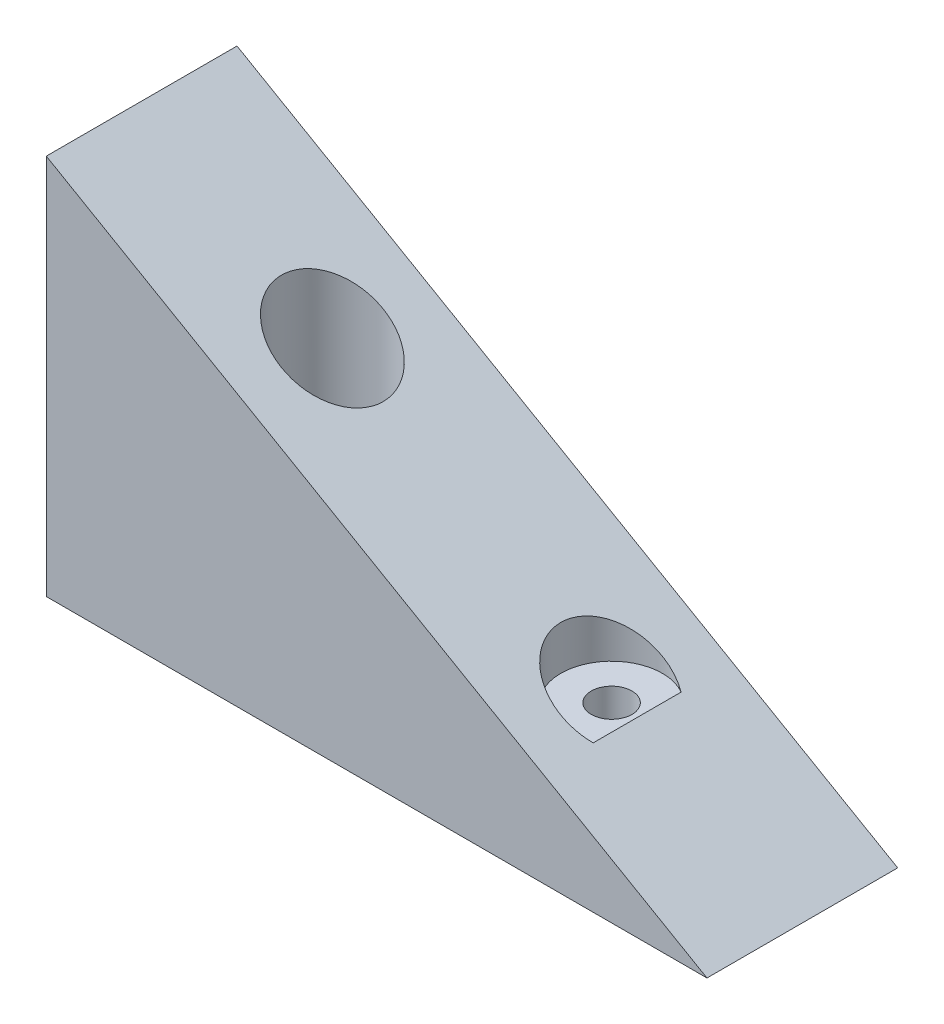
ISO-10303-21;
HEADER;
FILE_DESCRIPTION(('STEP AP214'),'2;1');
FILE_NAME('part.step','',(''),(''),'','','');
FILE_SCHEMA(('AUTOMOTIVE_DESIGN { 1 0 10303 214 1 1 1 1 }'));
ENDSEC;
DATA;
#1=APPLICATION_CONTEXT('core data for automotive mechanical design processes');
#2=APPLICATION_PROTOCOL_DEFINITION('international standard','automotive_design',2000,#1);
#3=PRODUCT_CONTEXT('',#1,'mechanical');
#4=PRODUCT('Part','Part','',(#3));
#5=PRODUCT_RELATED_PRODUCT_CATEGORY('part','',(#4));
#6=PRODUCT_DEFINITION_FORMATION('','',#4);
#7=PRODUCT_DEFINITION_CONTEXT('part definition',#1,'design');
#8=PRODUCT_DEFINITION('design','',#6,#7);
#9=PRODUCT_DEFINITION_SHAPE('','',#8);
#10=(LENGTH_UNIT() NAMED_UNIT(*) SI_UNIT(.MILLI.,.METRE.));
#11=(NAMED_UNIT(*) PLANE_ANGLE_UNIT() SI_UNIT($,.RADIAN.));
#12=(NAMED_UNIT(*) SI_UNIT($,.STERADIAN.) SOLID_ANGLE_UNIT());
#13=UNCERTAINTY_MEASURE_WITH_UNIT(LENGTH_MEASURE(1.E-05),#10,'distance_accuracy_value','');
#14=(GEOMETRIC_REPRESENTATION_CONTEXT(3) GLOBAL_UNCERTAINTY_ASSIGNED_CONTEXT((#13)) GLOBAL_UNIT_ASSIGNED_CONTEXT((#10,
#11,#12)) REPRESENTATION_CONTEXT('',''));
#15=CARTESIAN_POINT('',(0.,0.,0.));
#16=DIRECTION('',(0.,0.,1.));
#17=DIRECTION('',(1.,0.,0.));
#18=AXIS2_PLACEMENT_3D('',#15,#16,#17);
#19=CARTESIAN_POINT('',(0.,0.,15.));
#20=DIRECTION('',(0.500000000000001,0.866025403784438,0.));
#21=DIRECTION('',(-0.866025403784438,0.500000000000001,0.));
#22=AXIS2_PLACEMENT_3D('',#19,#20,#21);
#23=PLANE('',#22);
#24=CARTESIAN_POINT('',(-10.9807621135331,6.33974596215562,7.5));
#25=DIRECTION('',(0.500000000000001,0.866025403784438,0.));
#26=DIRECTION('',(0.866025403784438,-0.500000000000001,0.));
#27=AXIS2_PLACEMENT_3D('',#24,#25,#26);
#28=ELLIPSE('',#27,4.61880215351701,4.);
#29=CARTESIAN_POINT('',(-6.98076211353313,4.03034488539711,7.5));
#30=VERTEX_POINT('',#29);
#31=EDGE_CURVE('E94',#30,#30,#28,.F.);
#32=ORIENTED_EDGE('',*,*,#31,.T.);
#33=EDGE_LOOP('',(#32));
#34=FACE_BOUND('',#33,.T.);
#35=DIRECTION('',(0.866025403784438,-0.500000000000001,0.));
#36=VECTOR('',#35,1.);
#37=CARTESIAN_POINT('',(0.,0.,0.));
#38=LINE('',#37,#36);
#39=CARTESIAN_POINT('',(-25.9807621135331,15.,0.));
#40=VERTEX_POINT('',#39);
#41=CARTESIAN_POINT('',(25.9807621135331,-15.,0.));
#42=VERTEX_POINT('',#41);
#43=EDGE_CURVE('E138',#40,#42,#38,.T.);
#44=ORIENTED_EDGE('',*,*,#43,.F.);
#45=DIRECTION('',(0.,0.,-1.));
#46=VECTOR('',#45,1.);
#47=CARTESIAN_POINT('',(-25.9807621135331,15.,15.));
#48=LINE('',#47,#46);
#49=CARTESIAN_POINT('',(-25.9807621135331,15.,15.));
#50=VERTEX_POINT('',#49);
#51=EDGE_CURVE('E65',#50,#40,#48,.T.);
#52=ORIENTED_EDGE('',*,*,#51,.F.);
#53=DIRECTION('',(0.866025403784438,-0.500000000000001,0.));
#54=VECTOR('',#53,1.);
#55=CARTESIAN_POINT('',(0.,0.,15.));
#56=LINE('',#55,#54);
#57=CARTESIAN_POINT('',(25.9807621135331,-15.,15.));
#58=VERTEX_POINT('',#57);
#59=EDGE_CURVE('E150',#50,#58,#56,.T.);
#60=ORIENTED_EDGE('',*,*,#59,.T.);
#61=DIRECTION('',(0.,0.,-1.));
#62=VECTOR('',#61,1.);
#63=CARTESIAN_POINT('',(25.9807621135331,-15.,15.));
#64=LINE('',#63,#62);
#65=EDGE_CURVE('E134',#58,#42,#64,.T.);
#66=ORIENTED_EDGE('',*,*,#65,.T.);
#67=EDGE_LOOP('',(#44,#52,#60,#66));
#68=FACE_BOUND('',#67,.T.);
#69=DIRECTION('',(0.,0.,1.));
#70=VECTOR('',#69,1.);
#71=CARTESIAN_POINT('',(12.9903810567665,-7.5,15.));
#72=LINE('',#71,#70);
#73=CARTESIAN_POINT('',(12.9903810567665,-7.5,4.0414697192308));
#74=VERTEX_POINT('',#73);
#75=CARTESIAN_POINT('',(12.9903810567665,-7.5,10.9585302807692));
#76=VERTEX_POINT('',#75);
#77=EDGE_CURVE('E90',#74,#76,#72,.T.);
#78=ORIENTED_EDGE('',*,*,#77,.T.);
#79=CARTESIAN_POINT('',(10.9807621135331,-6.33974596215562,7.5));
#80=DIRECTION('',(0.500000000000001,0.866025403784438,0.));
#81=DIRECTION('',(0.866025403784438,-0.500000000000001,0.));
#82=AXIS2_PLACEMENT_3D('',#79,#80,#81);
#83=ELLIPSE('',#82,4.61880215351701,4.);
#84=EDGE_CURVE('E11',#76,#74,#83,.F.);
#85=ORIENTED_EDGE('',*,*,#84,.T.);
#86=EDGE_LOOP('',(#78,#85));
#87=FACE_BOUND('',#86,.T.);
#88=ADVANCED_FACE('F41',(#34,#68,#87),#23,.T.);
#89=CARTESIAN_POINT('',(10.9807621135331,15.,7.5));
#90=DIRECTION('',(0.,-1.,0.));
#91=DIRECTION('',(0.,0.,-1.));
#92=AXIS2_PLACEMENT_3D('',#89,#90,#91);
#93=CYLINDRICAL_SURFACE('',#92,1.6);
#94=CARTESIAN_POINT('',(10.9807621135331,-15.,7.5));
#95=DIRECTION('',(0.,-1.,0.));
#96=DIRECTION('',(0.,0.,-1.));
#97=AXIS2_PLACEMENT_3D('',#94,#95,#96);
#98=CIRCLE('',#97,1.6);
#99=CARTESIAN_POINT('',(10.9807621135331,-15.,5.9));
#100=VERTEX_POINT('',#99);
#101=EDGE_CURVE('E130',#100,#100,#98,.T.);
#102=CARTESIAN_POINT('',(10.9807621135331,-7.5,7.5));
#103=DIRECTION('',(0.,1.,0.));
#104=DIRECTION('',(0.,0.,1.));
#105=AXIS2_PLACEMENT_3D('',#102,#103,#104);
#106=CIRCLE('',#105,1.6);
#107=CARTESIAN_POINT('',(10.9807621135331,-7.5,5.9));
#108=VERTEX_POINT('',#107);
#109=EDGE_CURVE('E99',#108,#108,#106,.T.);
#110=CARTESIAN_POINT('',(10.9807621135331,-15.,5.9));
#111=CARTESIAN_POINT('',(10.9807621135331,-14.921875,5.9));
#112=CARTESIAN_POINT('',(10.9807621135331,-14.84375,5.9));
#113=CARTESIAN_POINT('',(10.9807621135331,-14.6875,5.9));
#114=CARTESIAN_POINT('',(10.9807621135331,-14.609375,5.9));
#115=CARTESIAN_POINT('',(10.9807621135331,-14.453125,5.9));
#116=CARTESIAN_POINT('',(10.9807621135331,-14.375,5.9));
#117=CARTESIAN_POINT('',(10.9807621135331,-14.21875,5.9));
#118=CARTESIAN_POINT('',(10.9807621135331,-14.140625,5.9));
#119=CARTESIAN_POINT('',(10.9807621135331,-13.984375,5.9));
#120=CARTESIAN_POINT('',(10.9807621135331,-13.90625,5.9));
#121=CARTESIAN_POINT('',(10.9807621135331,-13.75,5.9));
#122=CARTESIAN_POINT('',(10.9807621135331,-13.671875,5.9));
#123=CARTESIAN_POINT('',(10.9807621135331,-13.515625,5.9));
#124=CARTESIAN_POINT('',(10.9807621135331,-13.4375,5.9));
#125=CARTESIAN_POINT('',(10.9807621135331,-13.28125,5.9));
#126=CARTESIAN_POINT('',(10.9807621135331,-13.203125,5.9));
#127=CARTESIAN_POINT('',(10.9807621135331,-13.046875,5.9));
#128=CARTESIAN_POINT('',(10.9807621135331,-12.96875,5.9));
#129=CARTESIAN_POINT('',(10.9807621135331,-12.8125,5.9));
#130=CARTESIAN_POINT('',(10.9807621135331,-12.734375,5.9));
#131=CARTESIAN_POINT('',(10.9807621135331,-12.578125,5.9));
#132=CARTESIAN_POINT('',(10.9807621135331,-12.5,5.9));
#133=CARTESIAN_POINT('',(10.9807621135331,-12.34375,5.9));
#134=CARTESIAN_POINT('',(10.9807621135331,-12.265625,5.9));
#135=CARTESIAN_POINT('',(10.9807621135331,-12.109375,5.9));
#136=CARTESIAN_POINT('',(10.9807621135331,-12.03125,5.9));
#137=CARTESIAN_POINT('',(10.9807621135331,-11.875,5.9));
#138=CARTESIAN_POINT('',(10.9807621135331,-11.796875,5.9));
#139=CARTESIAN_POINT('',(10.9807621135331,-11.640625,5.9));
#140=CARTESIAN_POINT('',(10.9807621135331,-11.5625,5.9));
#141=CARTESIAN_POINT('',(10.9807621135331,-11.40625,5.9));
#142=CARTESIAN_POINT('',(10.9807621135331,-11.328125,5.9));
#143=CARTESIAN_POINT('',(10.9807621135331,-11.171875,5.9));
#144=CARTESIAN_POINT('',(10.9807621135331,-11.09375,5.9));
#145=CARTESIAN_POINT('',(10.9807621135331,-10.9375,5.9));
#146=CARTESIAN_POINT('',(10.9807621135331,-10.859375,5.9));
#147=CARTESIAN_POINT('',(10.9807621135331,-10.703125,5.9));
#148=CARTESIAN_POINT('',(10.9807621135331,-10.625,5.9));
#149=CARTESIAN_POINT('',(10.9807621135331,-10.46875,5.9));
#150=CARTESIAN_POINT('',(10.9807621135331,-10.390625,5.9));
#151=CARTESIAN_POINT('',(10.9807621135331,-10.234375,5.9));
#152=CARTESIAN_POINT('',(10.9807621135331,-10.15625,5.9));
#153=CARTESIAN_POINT('',(10.9807621135331,-10.,5.9));
#154=CARTESIAN_POINT('',(10.9807621135331,-9.92187500000001,5.9));
#155=CARTESIAN_POINT('',(10.9807621135331,-9.76562500000001,5.9));
#156=CARTESIAN_POINT('',(10.9807621135331,-9.68750000000001,5.9));
#157=CARTESIAN_POINT('',(10.9807621135331,-9.53125000000001,5.9));
#158=CARTESIAN_POINT('',(10.9807621135331,-9.45312500000001,5.9));
#159=CARTESIAN_POINT('',(10.9807621135331,-9.29687500000001,5.9));
#160=CARTESIAN_POINT('',(10.9807621135331,-9.21875000000001,5.9));
#161=CARTESIAN_POINT('',(10.9807621135331,-9.06250000000001,5.9));
#162=CARTESIAN_POINT('',(10.9807621135331,-8.98437500000001,5.9));
#163=CARTESIAN_POINT('',(10.9807621135331,-8.82812500000001,5.9));
#164=CARTESIAN_POINT('',(10.9807621135331,-8.75,5.9));
#165=CARTESIAN_POINT('',(10.9807621135331,-8.59375,5.9));
#166=CARTESIAN_POINT('',(10.9807621135331,-8.515625,5.9));
#167=CARTESIAN_POINT('',(10.9807621135331,-8.359375,5.9));
#168=CARTESIAN_POINT('',(10.9807621135331,-8.28125,5.9));
#169=CARTESIAN_POINT('',(10.9807621135331,-8.125,5.9));
#170=CARTESIAN_POINT('',(10.9807621135331,-8.046875,5.9));
#171=CARTESIAN_POINT('',(10.9807621135331,-7.890625,5.9));
#172=CARTESIAN_POINT('',(10.9807621135331,-7.8125,5.9));
#173=CARTESIAN_POINT('',(10.9807621135331,-7.65625,5.9));
#174=CARTESIAN_POINT('',(10.9807621135331,-7.578125,5.9));
#175=CARTESIAN_POINT('',(10.9807621135331,-7.5,5.9));
#176=B_SPLINE_CURVE_WITH_KNOTS('',3,(#110,#111,#112,#113,#114,#115,#116,#117,#118,#119,#120,
#121,#122,#123,#124,#125,#126,#127,#128,#129,#130,#131,#132,#133,#134,#135,#136,#137,#138,#139,
#140,#141,#142,#143,#144,#145,#146,#147,#148,#149,#150,#151,#152,#153,#154,#155,#156,#157,#158,
#159,#160,#161,#162,#163,#164,#165,#166,#167,#168,#169,#170,#171,#172,#173,#174,#175),
.UNSPECIFIED.,.F.,.F.,(4,2,2,2,2,2,2,2,2,2,2,2,2,2,2,2,2,2,2,2,2,2,2,2,2,2,2,2,2,2,2,2,4),(0.,
0.234375000000002,0.468750000000004,0.703125000000002,0.937500000000004,1.17187500000001,
1.40625000000001,1.64062500000001,1.87500000000001,2.10937500000001,2.34375000000001,
2.57812500000001,2.81250000000002,3.04687500000002,3.28125000000002,3.51562500000002,
3.75000000000002,3.98437500000002,4.21875000000002,4.45312500000002,4.68750000000002,
4.92187500000003,5.15625000000003,5.39062500000003,5.62500000000003,5.85937500000003,
6.09375000000003,6.32812500000004,6.56250000000004,6.79687500000004,7.03125000000004,
7.26562500000004,7.50000000000004),.UNSPECIFIED.);
#177=EDGE_CURVE('BSEAM102',#100,#108,#176,.T.);
#178=ORIENTED_EDGE('',*,*,#101,.T.);
#179=ORIENTED_EDGE('',*,*,#109,.T.);
#180=ORIENTED_EDGE('',*,*,#177,.T.);
#181=ORIENTED_EDGE('',*,*,#177,.F.);
#182=EDGE_LOOP('',(#178,#180,#179,#181));
#183=FACE_BOUND('',#182,.T.);
#184=ADVANCED_FACE('F102',(#183),#93,.F.);
#185=CARTESIAN_POINT('',(-10.9807621135331,15.,7.5));
#186=DIRECTION('',(0.,-1.,0.));
#187=DIRECTION('',(0.,0.,-1.));
#188=AXIS2_PLACEMENT_3D('',#185,#186,#187);
#189=CYLINDRICAL_SURFACE('',#188,1.6);
#190=CARTESIAN_POINT('',(-10.9807621135331,-15.,7.5));
#191=DIRECTION('',(0.,-1.,0.));
#192=DIRECTION('',(0.,0.,-1.));
#193=AXIS2_PLACEMENT_3D('',#190,#191,#192);
#194=CIRCLE('',#193,1.6);
#195=CARTESIAN_POINT('',(-10.9807621135331,-15.,5.9));
#196=VERTEX_POINT('',#195);
#197=EDGE_CURVE('E127',#196,#196,#194,.T.);
#198=CARTESIAN_POINT('',(-10.9807621135331,-7.5,7.5));
#199=DIRECTION('',(0.,1.,0.));
#200=DIRECTION('',(0.,0.,1.));
#201=AXIS2_PLACEMENT_3D('',#198,#199,#200);
#202=CIRCLE('',#201,1.6);
#203=CARTESIAN_POINT('',(-10.9807621135331,-7.5,5.9));
#204=VERTEX_POINT('',#203);
#205=EDGE_CURVE('E171',#204,#204,#202,.T.);
#206=CARTESIAN_POINT('',(-10.9807621135331,-15.,5.9));
#207=CARTESIAN_POINT('',(-10.9807621135331,-14.921875,5.9));
#208=CARTESIAN_POINT('',(-10.9807621135331,-14.84375,5.9));
#209=CARTESIAN_POINT('',(-10.9807621135331,-14.6875,5.9));
#210=CARTESIAN_POINT('',(-10.9807621135331,-14.609375,5.9));
#211=CARTESIAN_POINT('',(-10.9807621135331,-14.453125,5.9));
#212=CARTESIAN_POINT('',(-10.9807621135331,-14.375,5.9));
#213=CARTESIAN_POINT('',(-10.9807621135331,-14.21875,5.9));
#214=CARTESIAN_POINT('',(-10.9807621135331,-14.140625,5.9));
#215=CARTESIAN_POINT('',(-10.9807621135331,-13.984375,5.9));
#216=CARTESIAN_POINT('',(-10.9807621135331,-13.90625,5.9));
#217=CARTESIAN_POINT('',(-10.9807621135331,-13.75,5.9));
#218=CARTESIAN_POINT('',(-10.9807621135331,-13.671875,5.9));
#219=CARTESIAN_POINT('',(-10.9807621135331,-13.515625,5.9));
#220=CARTESIAN_POINT('',(-10.9807621135331,-13.4375,5.9));
#221=CARTESIAN_POINT('',(-10.9807621135331,-13.28125,5.9));
#222=CARTESIAN_POINT('',(-10.9807621135331,-13.203125,5.9));
#223=CARTESIAN_POINT('',(-10.9807621135331,-13.046875,5.9));
#224=CARTESIAN_POINT('',(-10.9807621135331,-12.96875,5.9));
#225=CARTESIAN_POINT('',(-10.9807621135331,-12.8125,5.9));
#226=CARTESIAN_POINT('',(-10.9807621135331,-12.734375,5.9));
#227=CARTESIAN_POINT('',(-10.9807621135331,-12.578125,5.9));
#228=CARTESIAN_POINT('',(-10.9807621135331,-12.5,5.9));
#229=CARTESIAN_POINT('',(-10.9807621135331,-12.34375,5.9));
#230=CARTESIAN_POINT('',(-10.9807621135331,-12.265625,5.9));
#231=CARTESIAN_POINT('',(-10.9807621135331,-12.109375,5.9));
#232=CARTESIAN_POINT('',(-10.9807621135331,-12.03125,5.9));
#233=CARTESIAN_POINT('',(-10.9807621135331,-11.875,5.9));
#234=CARTESIAN_POINT('',(-10.9807621135331,-11.796875,5.9));
#235=CARTESIAN_POINT('',(-10.9807621135331,-11.640625,5.9));
#236=CARTESIAN_POINT('',(-10.9807621135331,-11.5625,5.9));
#237=CARTESIAN_POINT('',(-10.9807621135331,-11.40625,5.9));
#238=CARTESIAN_POINT('',(-10.9807621135331,-11.328125,5.9));
#239=CARTESIAN_POINT('',(-10.9807621135331,-11.171875,5.9));
#240=CARTESIAN_POINT('',(-10.9807621135331,-11.09375,5.9));
#241=CARTESIAN_POINT('',(-10.9807621135331,-10.9375,5.9));
#242=CARTESIAN_POINT('',(-10.9807621135331,-10.859375,5.9));
#243=CARTESIAN_POINT('',(-10.9807621135331,-10.703125,5.9));
#244=CARTESIAN_POINT('',(-10.9807621135331,-10.625,5.9));
#245=CARTESIAN_POINT('',(-10.9807621135331,-10.46875,5.9));
#246=CARTESIAN_POINT('',(-10.9807621135331,-10.390625,5.9));
#247=CARTESIAN_POINT('',(-10.9807621135331,-10.234375,5.9));
#248=CARTESIAN_POINT('',(-10.9807621135331,-10.15625,5.9));
#249=CARTESIAN_POINT('',(-10.9807621135331,-10.,5.9));
#250=CARTESIAN_POINT('',(-10.9807621135331,-9.92187500000001,5.9));
#251=CARTESIAN_POINT('',(-10.9807621135331,-9.76562500000001,5.9));
#252=CARTESIAN_POINT('',(-10.9807621135331,-9.68750000000001,5.9));
#253=CARTESIAN_POINT('',(-10.9807621135331,-9.53125000000001,5.9));
#254=CARTESIAN_POINT('',(-10.9807621135331,-9.45312500000001,5.9));
#255=CARTESIAN_POINT('',(-10.9807621135331,-9.29687500000001,5.9));
#256=CARTESIAN_POINT('',(-10.9807621135331,-9.21875000000001,5.9));
#257=CARTESIAN_POINT('',(-10.9807621135331,-9.06250000000001,5.9));
#258=CARTESIAN_POINT('',(-10.9807621135331,-8.98437500000001,5.9));
#259=CARTESIAN_POINT('',(-10.9807621135331,-8.82812500000001,5.9));
#260=CARTESIAN_POINT('',(-10.9807621135331,-8.75,5.9));
#261=CARTESIAN_POINT('',(-10.9807621135331,-8.59375,5.9));
#262=CARTESIAN_POINT('',(-10.9807621135331,-8.515625,5.9));
#263=CARTESIAN_POINT('',(-10.9807621135331,-8.359375,5.9));
#264=CARTESIAN_POINT('',(-10.9807621135331,-8.28125,5.9));
#265=CARTESIAN_POINT('',(-10.9807621135331,-8.125,5.9));
#266=CARTESIAN_POINT('',(-10.9807621135331,-8.046875,5.9));
#267=CARTESIAN_POINT('',(-10.9807621135331,-7.890625,5.9));
#268=CARTESIAN_POINT('',(-10.9807621135331,-7.8125,5.9));
#269=CARTESIAN_POINT('',(-10.9807621135331,-7.65625,5.9));
#270=CARTESIAN_POINT('',(-10.9807621135331,-7.578125,5.9));
#271=CARTESIAN_POINT('',(-10.9807621135331,-7.5,5.9));
#272=B_SPLINE_CURVE_WITH_KNOTS('',3,(#206,#207,#208,#209,#210,#211,#212,#213,#214,#215,#216,
#217,#218,#219,#220,#221,#222,#223,#224,#225,#226,#227,#228,#229,#230,#231,#232,#233,#234,#235,
#236,#237,#238,#239,#240,#241,#242,#243,#244,#245,#246,#247,#248,#249,#250,#251,#252,#253,#254,
#255,#256,#257,#258,#259,#260,#261,#262,#263,#264,#265,#266,#267,#268,#269,#270,#271),
.UNSPECIFIED.,.F.,.F.,(4,2,2,2,2,2,2,2,2,2,2,2,2,2,2,2,2,2,2,2,2,2,2,2,2,2,2,2,2,2,2,2,4),(0.,
0.234375000000002,0.468750000000004,0.703125000000002,0.937500000000004,1.17187500000001,
1.40625000000001,1.64062500000001,1.87500000000001,2.10937500000001,2.34375000000001,
2.57812500000001,2.81250000000002,3.04687500000002,3.28125000000002,3.51562500000002,
3.75000000000002,3.98437500000002,4.21875000000002,4.45312500000002,4.68750000000002,
4.92187500000003,5.15625000000003,5.39062500000003,5.62500000000003,5.85937500000003,
6.09375000000003,6.32812500000004,6.56250000000004,6.79687500000004,7.03125000000004,
7.26562500000004,7.50000000000004),.UNSPECIFIED.);
#273=EDGE_CURVE('BSEAM108',#196,#204,#272,.T.);
#274=ORIENTED_EDGE('',*,*,#197,.T.);
#275=ORIENTED_EDGE('',*,*,#205,.T.);
#276=ORIENTED_EDGE('',*,*,#273,.T.);
#277=ORIENTED_EDGE('',*,*,#273,.F.);
#278=EDGE_LOOP('',(#274,#276,#275,#277));
#279=FACE_BOUND('',#278,.T.);
#280=ADVANCED_FACE('F108',(#279),#189,.F.);
#281=CARTESIAN_POINT('',(-25.9807621135331,0.,15.));
#282=DIRECTION('',(1.,0.,0.));
#283=DIRECTION('',(0.,1.,0.));
#284=AXIS2_PLACEMENT_3D('',#281,#282,#283);
#285=PLANE('',#284);
#286=DIRECTION('',(0.,-1.,0.));
#287=VECTOR('',#286,1.);
#288=CARTESIAN_POINT('',(-25.9807621135331,0.,0.));
#289=LINE('',#288,#287);
#290=CARTESIAN_POINT('',(-25.9807621135331,-15.,0.));
#291=VERTEX_POINT('',#290);
#292=EDGE_CURVE('E139',#40,#291,#289,.T.);
#293=ORIENTED_EDGE('',*,*,#292,.T.);
#294=DIRECTION('',(0.,0.,-1.));
#295=VECTOR('',#294,1.);
#296=CARTESIAN_POINT('',(-25.9807621135331,-15.,15.));
#297=LINE('',#296,#295);
#298=CARTESIAN_POINT('',(-25.9807621135331,-15.,15.));
#299=VERTEX_POINT('',#298);
#300=EDGE_CURVE('E50',#299,#291,#297,.T.);
#301=ORIENTED_EDGE('',*,*,#300,.F.);
#302=DIRECTION('',(0.,-1.,0.));
#303=VECTOR('',#302,1.);
#304=CARTESIAN_POINT('',(-25.9807621135331,0.,15.));
#305=LINE('',#304,#303);
#306=EDGE_CURVE('E142',#50,#299,#305,.T.);
#307=ORIENTED_EDGE('',*,*,#306,.F.);
#308=ORIENTED_EDGE('',*,*,#51,.T.);
#309=EDGE_LOOP('',(#293,#301,#307,#308));
#310=FACE_BOUND('',#309,.T.);
#311=ADVANCED_FACE('F43',(#310),#285,.F.);
#312=CARTESIAN_POINT('',(0.,-15.,15.));
#313=DIRECTION('',(0.,1.,0.));
#314=DIRECTION('',(0.,0.,1.));
#315=AXIS2_PLACEMENT_3D('',#312,#313,#314);
#316=PLANE('',#315);
#317=ORIENTED_EDGE('',*,*,#197,.F.);
#318=EDGE_LOOP('',(#317));
#319=FACE_BOUND('',#318,.T.);
#320=ORIENTED_EDGE('',*,*,#101,.F.);
#321=EDGE_LOOP('',(#320));
#322=FACE_BOUND('',#321,.T.);
#323=DIRECTION('',(1.,0.,0.));
#324=VECTOR('',#323,1.);
#325=CARTESIAN_POINT('',(0.,-15.,0.));
#326=LINE('',#325,#324);
#327=EDGE_CURVE('E132',#291,#42,#326,.T.);
#328=ORIENTED_EDGE('',*,*,#327,.T.);
#329=ORIENTED_EDGE('',*,*,#65,.F.);
#330=DIRECTION('',(1.,0.,0.));
#331=VECTOR('',#330,1.);
#332=CARTESIAN_POINT('',(0.,-15.,15.));
#333=LINE('',#332,#331);
#334=EDGE_CURVE('E86',#299,#58,#333,.T.);
#335=ORIENTED_EDGE('',*,*,#334,.F.);
#336=ORIENTED_EDGE('',*,*,#300,.T.);
#337=EDGE_LOOP('',(#328,#329,#335,#336));
#338=FACE_BOUND('',#337,.T.);
#339=ADVANCED_FACE('F115',(#319,#322,#338),#316,.F.);
#340=CARTESIAN_POINT('',(0.,0.,15.));
#341=DIRECTION('',(0.,0.,1.));
#342=DIRECTION('',(1.,0.,0.));
#343=AXIS2_PLACEMENT_3D('',#340,#341,#342);
#344=PLANE('',#343);
#345=ORIENTED_EDGE('',*,*,#306,.T.);
#346=ORIENTED_EDGE('',*,*,#334,.T.);
#347=ORIENTED_EDGE('',*,*,#59,.F.);
#348=EDGE_LOOP('',(#345,#346,#347));
#349=FACE_BOUND('',#348,.T.);
#350=ADVANCED_FACE('F117',(#349),#344,.T.);
#351=CARTESIAN_POINT('',(0.,0.,0.));
#352=DIRECTION('',(0.,0.,1.));
#353=DIRECTION('',(1.,0.,0.));
#354=AXIS2_PLACEMENT_3D('',#351,#352,#353);
#355=PLANE('',#354);
#356=ORIENTED_EDGE('',*,*,#292,.F.);
#357=ORIENTED_EDGE('',*,*,#43,.T.);
#358=ORIENTED_EDGE('',*,*,#327,.F.);
#359=EDGE_LOOP('',(#356,#357,#358));
#360=FACE_BOUND('',#359,.T.);
#361=ADVANCED_FACE('F113',(#360),#355,.F.);
#362=CARTESIAN_POINT('',(-10.9807621135331,15.,7.5));
#363=DIRECTION('',(0.,-1.,0.));
#364=DIRECTION('',(0.,0.,-1.));
#365=AXIS2_PLACEMENT_3D('',#362,#363,#364);
#366=CYLINDRICAL_SURFACE('',#365,4.);
#367=ORIENTED_EDGE('',*,*,#31,.F.);
#368=EDGE_LOOP('',(#367));
#369=FACE_BOUND('',#368,.T.);
#370=CARTESIAN_POINT('',(-10.9807621135331,-7.5,7.5));
#371=DIRECTION('',(0.,1.,0.));
#372=DIRECTION('',(0.,0.,1.));
#373=AXIS2_PLACEMENT_3D('',#370,#371,#372);
#374=CIRCLE('',#373,4.);
#375=CARTESIAN_POINT('',(-10.9807621135331,-7.5,11.5));
#376=VERTEX_POINT('',#375);
#377=EDGE_CURVE('E167',#376,#376,#374,.T.);
#378=ORIENTED_EDGE('',*,*,#377,.F.);
#379=EDGE_LOOP('',(#378));
#380=FACE_BOUND('',#379,.T.);
#381=ADVANCED_FACE('F190',(#369,#380),#366,.F.);
#382=CARTESIAN_POINT('',(-10.9807621135331,-7.5,7.5));
#383=DIRECTION('',(0.,1.,0.));
#384=DIRECTION('',(0.,0.,1.));
#385=AXIS2_PLACEMENT_3D('',#382,#383,#384);
#386=PLANE('',#385);
#387=ORIENTED_EDGE('',*,*,#205,.F.);
#388=EDGE_LOOP('',(#387));
#389=FACE_BOUND('',#388,.T.);
#390=ORIENTED_EDGE('',*,*,#377,.T.);
#391=EDGE_LOOP('',(#390));
#392=FACE_BOUND('',#391,.T.);
#393=ADVANCED_FACE('F185',(#389,#392),#386,.T.);
#394=CARTESIAN_POINT('',(10.9807621135331,15.,7.5));
#395=DIRECTION('',(0.,-1.,0.));
#396=DIRECTION('',(0.,0.,-1.));
#397=AXIS2_PLACEMENT_3D('',#394,#395,#396);
#398=CYLINDRICAL_SURFACE('',#397,4.);
#399=CARTESIAN_POINT('',(10.9807621135331,-7.5,7.5));
#400=DIRECTION('',(0.,1.,0.));
#401=DIRECTION('',(0.,0.,1.));
#402=AXIS2_PLACEMENT_3D('',#399,#400,#401);
#403=CIRCLE('',#402,4.);
#404=EDGE_CURVE('E56',#74,#76,#403,.T.);
#405=ORIENTED_EDGE('',*,*,#404,.F.);
#406=ORIENTED_EDGE('',*,*,#84,.F.);
#407=EDGE_LOOP('',(#405,#406));
#408=FACE_BOUND('',#407,.T.);
#409=ADVANCED_FACE('F97',(#408),#398,.F.);
#410=CARTESIAN_POINT('',(10.9807621135331,-7.5,7.5));
#411=DIRECTION('',(0.,1.,0.));
#412=DIRECTION('',(0.,0.,1.));
#413=AXIS2_PLACEMENT_3D('',#410,#411,#412);
#414=PLANE('',#413);
#415=ORIENTED_EDGE('',*,*,#109,.F.);
#416=EDGE_LOOP('',(#415));
#417=FACE_BOUND('',#416,.T.);
#418=ORIENTED_EDGE('',*,*,#404,.T.);
#419=ORIENTED_EDGE('',*,*,#77,.F.);
#420=EDGE_LOOP('',(#418,#419));
#421=FACE_BOUND('',#420,.T.);
#422=ADVANCED_FACE('F91',(#417,#421),#414,.T.);
#423=CLOSED_SHELL('',(#88,#184,#280,#311,#339,#350,#361,#381,#393,#409,#422));
#424=MANIFOLD_SOLID_BREP('B2',#423);
#425=ADVANCED_BREP_SHAPE_REPRESENTATION('',(#18,#424),#14);
#426=SHAPE_DEFINITION_REPRESENTATION(#9,#425);
ENDSEC;
END-ISO-10303-21;
